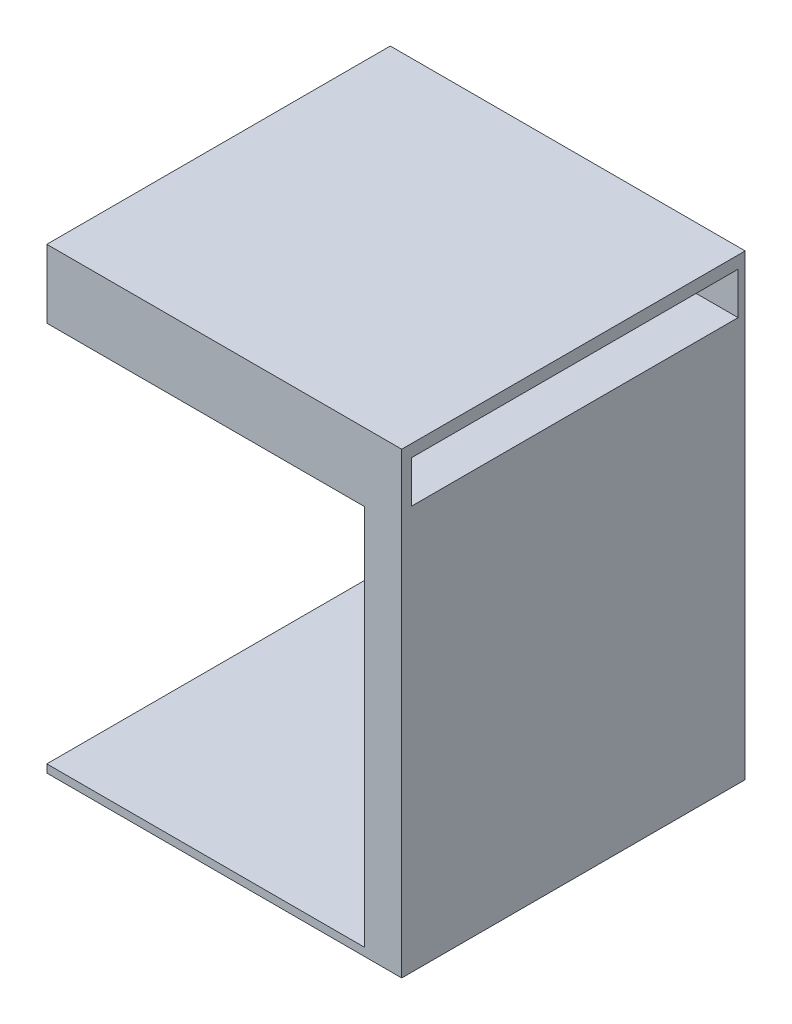
ISO-10303-21;
HEADER;
FILE_DESCRIPTION(('STEP AP214'),'2;1');
FILE_NAME('part.step','',(''),(''),'','','');
FILE_SCHEMA(('AUTOMOTIVE_DESIGN { 1 0 10303 214 1 1 1 1 }'));
ENDSEC;
DATA;
#1=APPLICATION_CONTEXT('core data for automotive mechanical design processes');
#2=APPLICATION_PROTOCOL_DEFINITION('international standard','automotive_design',2000,#1);
#3=PRODUCT_CONTEXT('',#1,'mechanical');
#4=PRODUCT('Part','Part','',(#3));
#5=PRODUCT_RELATED_PRODUCT_CATEGORY('part','',(#4));
#6=PRODUCT_DEFINITION_FORMATION('','',#4);
#7=PRODUCT_DEFINITION_CONTEXT('part definition',#1,'design');
#8=PRODUCT_DEFINITION('design','',#6,#7);
#9=PRODUCT_DEFINITION_SHAPE('','',#8);
#10=(LENGTH_UNIT() NAMED_UNIT(*) SI_UNIT(.MILLI.,.METRE.));
#11=(NAMED_UNIT(*) PLANE_ANGLE_UNIT() SI_UNIT($,.RADIAN.));
#12=(NAMED_UNIT(*) SI_UNIT($,.STERADIAN.) SOLID_ANGLE_UNIT());
#13=UNCERTAINTY_MEASURE_WITH_UNIT(LENGTH_MEASURE(1.E-05),#10,'distance_accuracy_value','');
#14=(GEOMETRIC_REPRESENTATION_CONTEXT(3) GLOBAL_UNCERTAINTY_ASSIGNED_CONTEXT((#13)) GLOBAL_UNIT_ASSIGNED_CONTEXT((#10,
#11,#12)) REPRESENTATION_CONTEXT('',''));
#15=CARTESIAN_POINT('',(0.,0.,0.));
#16=DIRECTION('',(0.,0.,1.));
#17=DIRECTION('',(1.,0.,0.));
#18=AXIS2_PLACEMENT_3D('',#15,#16,#17);
#19=CARTESIAN_POINT('',(-46.5,102.095291963001,-41.));
#20=DIRECTION('',(0.,1.,0.));
#21=DIRECTION('',(0.,0.,1.));
#22=AXIS2_PLACEMENT_3D('',#19,#20,#21);
#23=PLANE('',#22);
#24=DIRECTION('',(-1.,0.,0.));
#25=VECTOR('',#24,1.);
#26=CARTESIAN_POINT('',(-46.5,102.095291963001,45.));
#27=LINE('',#26,#25);
#28=CARTESIAN_POINT('',(36.6884651724041,102.095291963001,45.));
#29=VERTEX_POINT('',#28);
#30=CARTESIAN_POINT('',(-46.5,102.095291963001,45.));
#31=VERTEX_POINT('',#30);
#32=EDGE_CURVE('E212',#29,#31,#27,.T.);
#33=ORIENTED_EDGE('',*,*,#32,.T.);
#34=DIRECTION('',(0.,0.,1.));
#35=VECTOR('',#34,1.);
#36=CARTESIAN_POINT('',(-46.5,102.095291963001,-41.));
#37=LINE('',#36,#35);
#38=CARTESIAN_POINT('',(-46.5,102.095291963001,-41.));
#39=VERTEX_POINT('',#38);
#40=EDGE_CURVE('E228',#39,#31,#37,.T.);
#41=ORIENTED_EDGE('',*,*,#40,.F.);
#42=DIRECTION('',(-1.,0.,0.));
#43=VECTOR('',#42,1.);
#44=CARTESIAN_POINT('',(-46.5,102.095291963001,-41.));
#45=LINE('',#44,#43);
#46=CARTESIAN_POINT('',(36.6884651724041,102.095291963001,-41.));
#47=VERTEX_POINT('',#46);
#48=EDGE_CURVE('E219',#47,#39,#45,.T.);
#49=ORIENTED_EDGE('',*,*,#48,.F.);
#50=DIRECTION('',(0.,0.,1.));
#51=VECTOR('',#50,1.);
#52=CARTESIAN_POINT('',(36.6884651724041,102.095291963001,-41.));
#53=LINE('',#52,#51);
#54=EDGE_CURVE('E233',#47,#29,#53,.T.);
#55=ORIENTED_EDGE('',*,*,#54,.T.);
#56=EDGE_LOOP('',(#33,#41,#49,#55));
#57=FACE_BOUND('',#56,.T.);
#58=DIRECTION('',(0.,0.,1.));
#59=VECTOR('',#58,1.);
#60=CARTESIAN_POINT('',(13.5,102.095291963001,-35.659899798973));
#61=LINE('',#60,#59);
#62=CARTESIAN_POINT('',(13.5,102.095291963001,-35.659899798973));
#63=VERTEX_POINT('',#62);
#64=CARTESIAN_POINT('',(13.5,102.095291963001,38.7416195346867));
#65=VERTEX_POINT('',#64);
#66=EDGE_CURVE('E154',#63,#65,#61,.T.);
#67=ORIENTED_EDGE('',*,*,#66,.F.);
#68=DIRECTION('',(-1.,0.,0.));
#69=VECTOR('',#68,1.);
#70=CARTESIAN_POINT('',(13.5,102.095291963001,-35.659899798973));
#71=LINE('',#70,#69);
#72=CARTESIAN_POINT('',(-36.5,102.095291963001,-35.659899798973));
#73=VERTEX_POINT('',#72);
#74=EDGE_CURVE('E165',#63,#73,#71,.T.);
#75=ORIENTED_EDGE('',*,*,#74,.T.);
#76=DIRECTION('',(0.,0.,1.));
#77=VECTOR('',#76,1.);
#78=CARTESIAN_POINT('',(-36.5,102.095291963001,-35.659899798973));
#79=LINE('',#78,#77);
#80=CARTESIAN_POINT('',(-36.5,102.095291963001,38.7416195346867));
#81=VERTEX_POINT('',#80);
#82=EDGE_CURVE('E175',#73,#81,#79,.T.);
#83=ORIENTED_EDGE('',*,*,#82,.T.);
#84=DIRECTION('',(-1.,0.,0.));
#85=VECTOR('',#84,1.);
#86=CARTESIAN_POINT('',(13.5,102.095291963001,38.7416195346867));
#87=LINE('',#86,#85);
#88=EDGE_CURVE('E167',#65,#81,#87,.T.);
#89=ORIENTED_EDGE('',*,*,#88,.F.);
#90=EDGE_LOOP('',(#67,#75,#83,#89));
#91=FACE_BOUND('',#90,.T.);
#92=ADVANCED_FACE('F39',(#57,#91),#23,.F.);
#93=CARTESIAN_POINT('',(-39.5,105.785550359176,42.4103335057745));
#94=DIRECTION('',(0.,-1.,0.));
#95=DIRECTION('',(0.,0.,-1.));
#96=AXIS2_PLACEMENT_3D('',#93,#94,#95);
#97=PLANE('',#96);
#98=DIRECTION('',(0.,0.,-1.));
#99=VECTOR('',#98,1.);
#100=CARTESIAN_POINT('',(46.5,105.785550359176,42.4103335057745));
#101=LINE('',#100,#99);
#102=CARTESIAN_POINT('',(46.5,105.785550359176,42.4103335057745));
#103=VERTEX_POINT('',#102);
#104=CARTESIAN_POINT('',(46.5,105.785550359176,-43.144076299992));
#105=VERTEX_POINT('',#104);
#106=EDGE_CURVE('E193',#103,#105,#101,.T.);
#107=ORIENTED_EDGE('',*,*,#106,.T.);
#108=DIRECTION('',(1.,0.,0.));
#109=VECTOR('',#108,1.);
#110=CARTESIAN_POINT('',(-39.5,105.785550359176,-43.144076299992));
#111=LINE('',#110,#109);
#112=CARTESIAN_POINT('',(-39.5,105.785550359176,-43.144076299992));
#113=VERTEX_POINT('',#112);
#114=EDGE_CURVE('E206',#113,#105,#111,.T.);
#115=ORIENTED_EDGE('',*,*,#114,.F.);
#116=DIRECTION('',(0.,0.,-1.));
#117=VECTOR('',#116,1.);
#118=CARTESIAN_POINT('',(-39.5,105.785550359176,42.4103335057745));
#119=LINE('',#118,#117);
#120=CARTESIAN_POINT('',(-39.5,105.785550359176,42.4103335057745));
#121=VERTEX_POINT('',#120);
#122=EDGE_CURVE('E182',#121,#113,#119,.T.);
#123=ORIENTED_EDGE('',*,*,#122,.F.);
#124=DIRECTION('',(1.,0.,0.));
#125=VECTOR('',#124,1.);
#126=CARTESIAN_POINT('',(-39.5,105.785550359176,42.4103335057745));
#127=LINE('',#126,#125);
#128=EDGE_CURVE('E192',#121,#103,#127,.T.);
#129=ORIENTED_EDGE('',*,*,#128,.T.);
#130=EDGE_LOOP('',(#107,#115,#123,#129));
#131=FACE_BOUND('',#130,.T.);
#132=DIRECTION('',(0.,0.,-1.));
#133=VECTOR('',#132,1.);
#134=CARTESIAN_POINT('',(13.5,105.785550359176,42.4103335057745));
#135=LINE('',#134,#133);
#136=CARTESIAN_POINT('',(13.5,105.785550359176,38.7416195346867));
#137=VERTEX_POINT('',#136);
#138=CARTESIAN_POINT('',(13.5,105.785550359176,-35.659899798973));
#139=VERTEX_POINT('',#138);
#140=EDGE_CURVE('E11',#137,#139,#135,.T.);
#141=ORIENTED_EDGE('',*,*,#140,.F.);
#142=DIRECTION('',(-1.,0.,0.));
#143=VECTOR('',#142,1.);
#144=CARTESIAN_POINT('',(-39.5,105.785550359176,38.7416195346867));
#145=LINE('',#144,#143);
#146=CARTESIAN_POINT('',(-36.5,105.785550359176,38.7416195346867));
#147=VERTEX_POINT('',#146);
#148=EDGE_CURVE('E272',#137,#147,#145,.T.);
#149=ORIENTED_EDGE('',*,*,#148,.T.);
#150=DIRECTION('',(0.,0.,-1.));
#151=VECTOR('',#150,1.);
#152=CARTESIAN_POINT('',(-36.5,105.785550359176,42.4103335057745));
#153=LINE('',#152,#151);
#154=CARTESIAN_POINT('',(-36.5,105.785550359176,-35.659899798973));
#155=VERTEX_POINT('',#154);
#156=EDGE_CURVE('E269',#147,#155,#153,.T.);
#157=ORIENTED_EDGE('',*,*,#156,.T.);
#158=DIRECTION('',(1.,0.,0.));
#159=VECTOR('',#158,1.);
#160=CARTESIAN_POINT('',(-39.5,105.785550359176,-35.659899798973));
#161=LINE('',#160,#159);
#162=EDGE_CURVE('E50',#155,#139,#161,.T.);
#163=ORIENTED_EDGE('',*,*,#162,.T.);
#164=EDGE_LOOP('',(#141,#149,#157,#163));
#165=FACE_BOUND('',#164,.T.);
#166=ADVANCED_FACE('F277',(#131,#165),#97,.F.);
#167=CARTESIAN_POINT('',(-46.5,120.,45.));
#168=DIRECTION('',(0.,0.,-1.));
#169=DIRECTION('',(-1.,0.,0.));
#170=AXIS2_PLACEMENT_3D('',#167,#168,#169);
#171=PLANE('',#170);
#172=DIRECTION('',(1.,0.,0.));
#173=VECTOR('',#172,1.);
#174=CARTESIAN_POINT('',(-46.5,2.0952919630007,45.));
#175=LINE('',#174,#173);
#176=CARTESIAN_POINT('',(-46.5,2.0952919630007,45.));
#177=VERTEX_POINT('',#176);
#178=CARTESIAN_POINT('',(36.6884651724042,2.09529196300071,45.));
#179=VERTEX_POINT('',#178);
#180=EDGE_CURVE('E201',#177,#179,#175,.T.);
#181=ORIENTED_EDGE('',*,*,#180,.F.);
#182=DIRECTION('',(0.,-1.,0.));
#183=VECTOR('',#182,1.);
#184=CARTESIAN_POINT('',(-46.5,120.,45.));
#185=LINE('',#184,#183);
#186=CARTESIAN_POINT('',(-46.5,0.,45.));
#187=VERTEX_POINT('',#186);
#188=EDGE_CURVE('E257',#177,#187,#185,.T.);
#189=ORIENTED_EDGE('',*,*,#188,.T.);
#190=DIRECTION('',(1.,0.,0.));
#191=VECTOR('',#190,1.);
#192=CARTESIAN_POINT('',(-46.5,0.,45.));
#193=LINE('',#192,#191);
#194=CARTESIAN_POINT('',(46.5,0.,45.));
#195=VERTEX_POINT('',#194);
#196=EDGE_CURVE('E245',#187,#195,#193,.T.);
#197=ORIENTED_EDGE('',*,*,#196,.T.);
#198=DIRECTION('',(0.,-1.,0.));
#199=VECTOR('',#198,1.);
#200=CARTESIAN_POINT('',(46.5,120.,45.));
#201=LINE('',#200,#199);
#202=CARTESIAN_POINT('',(46.5,120.,45.));
#203=VERTEX_POINT('',#202);
#204=EDGE_CURVE('E249',#203,#195,#201,.T.);
#205=ORIENTED_EDGE('',*,*,#204,.F.);
#206=DIRECTION('',(1.,0.,0.));
#207=VECTOR('',#206,1.);
#208=CARTESIAN_POINT('',(-46.5,120.,45.));
#209=LINE('',#208,#207);
#210=CARTESIAN_POINT('',(-46.5,120.,45.));
#211=VERTEX_POINT('',#210);
#212=EDGE_CURVE('E250',#211,#203,#209,.T.);
#213=ORIENTED_EDGE('',*,*,#212,.F.);
#214=EDGE_CURVE('E261',#211,#31,#185,.T.);
#215=ORIENTED_EDGE('',*,*,#214,.T.);
#216=ORIENTED_EDGE('',*,*,#32,.F.);
#217=DIRECTION('',(0.,1.,0.));
#218=VECTOR('',#217,1.);
#219=CARTESIAN_POINT('',(36.6884651724041,102.095291963001,45.));
#220=LINE('',#219,#218);
#221=EDGE_CURVE('E223',#179,#29,#220,.T.);
#222=ORIENTED_EDGE('',*,*,#221,.F.);
#223=EDGE_LOOP('',(#181,#189,#197,#205,#213,#215,#216,#222));
#224=FACE_BOUND('',#223,.T.);
#225=ADVANCED_FACE('F296',(#224),#171,.F.);
#226=CARTESIAN_POINT('',(46.5,120.,-45.));
#227=DIRECTION('',(-1.,0.,0.));
#228=DIRECTION('',(0.,0.,1.));
#229=AXIS2_PLACEMENT_3D('',#226,#227,#228);
#230=PLANE('',#229);
#231=ORIENTED_EDGE('',*,*,#106,.F.);
#232=DIRECTION('',(0.,-1.,0.));
#233=VECTOR('',#232,1.);
#234=CARTESIAN_POINT('',(46.5,116.785550359176,42.4103335057745));
#235=LINE('',#234,#233);
#236=CARTESIAN_POINT('',(46.5,116.785550359176,42.4103335057745));
#237=VERTEX_POINT('',#236);
#238=EDGE_CURVE('E177',#237,#103,#235,.T.);
#239=ORIENTED_EDGE('',*,*,#238,.F.);
#240=DIRECTION('',(0.,0.,1.));
#241=VECTOR('',#240,1.);
#242=CARTESIAN_POINT('',(46.5,116.785550359176,42.4103335057745));
#243=LINE('',#242,#241);
#244=CARTESIAN_POINT('',(46.5,116.785550359176,-43.144076299992));
#245=VERTEX_POINT('',#244);
#246=EDGE_CURVE('E185',#245,#237,#243,.T.);
#247=ORIENTED_EDGE('',*,*,#246,.F.);
#248=DIRECTION('',(0.,1.,0.));
#249=VECTOR('',#248,1.);
#250=CARTESIAN_POINT('',(46.5,116.785550359176,-43.144076299992));
#251=LINE('',#250,#249);
#252=EDGE_CURVE('E198',#105,#245,#251,.T.);
#253=ORIENTED_EDGE('',*,*,#252,.F.);
#254=EDGE_LOOP('',(#231,#239,#247,#253));
#255=FACE_BOUND('',#254,.T.);
#256=DIRECTION('',(0.,0.,-1.));
#257=VECTOR('',#256,1.);
#258=CARTESIAN_POINT('',(46.5,0.,-45.));
#259=LINE('',#258,#257);
#260=CARTESIAN_POINT('',(46.5,0.,-45.));
#261=VERTEX_POINT('',#260);
#262=EDGE_CURVE('E235',#195,#261,#259,.T.);
#263=ORIENTED_EDGE('',*,*,#262,.T.);
#264=DIRECTION('',(0.,-1.,0.));
#265=VECTOR('',#264,1.);
#266=CARTESIAN_POINT('',(46.5,120.,-45.));
#267=LINE('',#266,#265);
#268=CARTESIAN_POINT('',(46.5,120.,-45.));
#269=VERTEX_POINT('',#268);
#270=EDGE_CURVE('E270',#269,#261,#267,.T.);
#271=ORIENTED_EDGE('',*,*,#270,.F.);
#272=DIRECTION('',(0.,0.,-1.));
#273=VECTOR('',#272,1.);
#274=CARTESIAN_POINT('',(46.5,120.,-45.));
#275=LINE('',#274,#273);
#276=EDGE_CURVE('E239',#203,#269,#275,.T.);
#277=ORIENTED_EDGE('',*,*,#276,.F.);
#278=ORIENTED_EDGE('',*,*,#204,.T.);
#279=EDGE_LOOP('',(#263,#271,#277,#278));
#280=FACE_BOUND('',#279,.T.);
#281=ADVANCED_FACE('F41',(#255,#280),#230,.F.);
#282=CARTESIAN_POINT('',(-46.5,120.,-45.));
#283=DIRECTION('',(0.,0.,1.));
#284=DIRECTION('',(1.,0.,0.));
#285=AXIS2_PLACEMENT_3D('',#282,#283,#284);
#286=PLANE('',#285);
#287=DIRECTION('',(-1.,0.,0.));
#288=VECTOR('',#287,1.);
#289=CARTESIAN_POINT('',(-46.5,0.,-45.));
#290=LINE('',#289,#288);
#291=CARTESIAN_POINT('',(-46.5,0.,-45.));
#292=VERTEX_POINT('',#291);
#293=EDGE_CURVE('E252',#261,#292,#290,.T.);
#294=ORIENTED_EDGE('',*,*,#293,.T.);
#295=DIRECTION('',(0.,-1.,0.));
#296=VECTOR('',#295,1.);
#297=CARTESIAN_POINT('',(-46.5,120.,-45.));
#298=LINE('',#297,#296);
#299=CARTESIAN_POINT('',(-46.5,120.,-45.));
#300=VERTEX_POINT('',#299);
#301=EDGE_CURVE('E262',#300,#292,#298,.T.);
#302=ORIENTED_EDGE('',*,*,#301,.F.);
#303=DIRECTION('',(-1.,0.,0.));
#304=VECTOR('',#303,1.);
#305=CARTESIAN_POINT('',(-46.5,120.,-45.));
#306=LINE('',#305,#304);
#307=EDGE_CURVE('E241',#269,#300,#306,.T.);
#308=ORIENTED_EDGE('',*,*,#307,.F.);
#309=ORIENTED_EDGE('',*,*,#270,.T.);
#310=EDGE_LOOP('',(#294,#302,#308,#309));
#311=FACE_BOUND('',#310,.T.);
#312=ADVANCED_FACE('F324',(#311),#286,.F.);
#313=CARTESIAN_POINT('',(-46.5,120.,-45.));
#314=DIRECTION('',(1.,0.,0.));
#315=DIRECTION('',(0.,0.,-1.));
#316=AXIS2_PLACEMENT_3D('',#313,#314,#315);
#317=PLANE('',#316);
#318=DIRECTION('',(0.,-1.,0.));
#319=VECTOR('',#318,1.);
#320=CARTESIAN_POINT('',(-46.5,102.095291963001,-41.));
#321=LINE('',#320,#319);
#322=CARTESIAN_POINT('',(-46.5,2.0952919630007,-41.));
#323=VERTEX_POINT('',#322);
#324=EDGE_CURVE('E209',#39,#323,#321,.T.);
#325=ORIENTED_EDGE('',*,*,#324,.F.);
#326=ORIENTED_EDGE('',*,*,#40,.T.);
#327=ORIENTED_EDGE('',*,*,#214,.F.);
#328=DIRECTION('',(0.,0.,1.));
#329=VECTOR('',#328,1.);
#330=CARTESIAN_POINT('',(-46.5,120.,-45.));
#331=LINE('',#330,#329);
#332=EDGE_CURVE('E242',#300,#211,#331,.T.);
#333=ORIENTED_EDGE('',*,*,#332,.F.);
#334=ORIENTED_EDGE('',*,*,#301,.T.);
#335=DIRECTION('',(0.,0.,1.));
#336=VECTOR('',#335,1.);
#337=CARTESIAN_POINT('',(-46.5,0.,-45.));
#338=LINE('',#337,#336);
#339=EDGE_CURVE('E255',#292,#187,#338,.T.);
#340=ORIENTED_EDGE('',*,*,#339,.T.);
#341=ORIENTED_EDGE('',*,*,#188,.F.);
#342=DIRECTION('',(0.,0.,1.));
#343=VECTOR('',#342,1.);
#344=CARTESIAN_POINT('',(-46.5,2.0952919630007,-41.));
#345=LINE('',#344,#343);
#346=EDGE_CURVE('E224',#323,#177,#345,.T.);
#347=ORIENTED_EDGE('',*,*,#346,.F.);
#348=EDGE_LOOP('',(#325,#326,#327,#333,#334,#340,#341,#347));
#349=FACE_BOUND('',#348,.T.);
#350=ADVANCED_FACE('F316',(#349),#317,.F.);
#351=CARTESIAN_POINT('',(0.,120.,0.));
#352=DIRECTION('',(0.,1.,0.));
#353=DIRECTION('',(0.,0.,1.));
#354=AXIS2_PLACEMENT_3D('',#351,#352,#353);
#355=PLANE('',#354);
#356=ORIENTED_EDGE('',*,*,#276,.T.);
#357=ORIENTED_EDGE('',*,*,#307,.T.);
#358=ORIENTED_EDGE('',*,*,#332,.T.);
#359=ORIENTED_EDGE('',*,*,#212,.T.);
#360=EDGE_LOOP('',(#356,#357,#358,#359));
#361=FACE_BOUND('',#360,.T.);
#362=ADVANCED_FACE('F311',(#361),#355,.T.);
#363=CARTESIAN_POINT('',(0.,0.,0.));
#364=DIRECTION('',(0.,1.,0.));
#365=DIRECTION('',(0.,0.,1.));
#366=AXIS2_PLACEMENT_3D('',#363,#364,#365);
#367=PLANE('',#366);
#368=ORIENTED_EDGE('',*,*,#262,.F.);
#369=ORIENTED_EDGE('',*,*,#196,.F.);
#370=ORIENTED_EDGE('',*,*,#339,.F.);
#371=ORIENTED_EDGE('',*,*,#293,.F.);
#372=EDGE_LOOP('',(#368,#369,#370,#371));
#373=FACE_BOUND('',#372,.T.);
#374=ADVANCED_FACE('F306',(#373),#367,.F.);
#375=CARTESIAN_POINT('',(36.6884651724041,102.095291963001,-41.));
#376=DIRECTION('',(1.,0.,0.));
#377=DIRECTION('',(0.,1.,0.));
#378=AXIS2_PLACEMENT_3D('',#375,#376,#377);
#379=PLANE('',#378);
#380=ORIENTED_EDGE('',*,*,#221,.T.);
#381=ORIENTED_EDGE('',*,*,#54,.F.);
#382=DIRECTION('',(0.,1.,0.));
#383=VECTOR('',#382,1.);
#384=CARTESIAN_POINT('',(36.6884651724041,102.095291963001,-41.));
#385=LINE('',#384,#383);
#386=CARTESIAN_POINT('',(36.6884651724042,2.0952919630007,-41.));
#387=VERTEX_POINT('',#386);
#388=EDGE_CURVE('E220',#387,#47,#385,.T.);
#389=ORIENTED_EDGE('',*,*,#388,.F.);
#390=DIRECTION('',(0.,0.,1.));
#391=VECTOR('',#390,1.);
#392=CARTESIAN_POINT('',(36.6884651724042,2.0952919630007,-41.));
#393=LINE('',#392,#391);
#394=EDGE_CURVE('E231',#387,#179,#393,.T.);
#395=ORIENTED_EDGE('',*,*,#394,.T.);
#396=EDGE_LOOP('',(#380,#381,#389,#395));
#397=FACE_BOUND('',#396,.T.);
#398=ADVANCED_FACE('F304',(#397),#379,.F.);
#399=CARTESIAN_POINT('',(-46.5,2.0952919630007,-41.));
#400=DIRECTION('',(0.,-1.,0.));
#401=DIRECTION('',(0.,0.,-1.));
#402=AXIS2_PLACEMENT_3D('',#399,#400,#401);
#403=PLANE('',#402);
#404=ORIENTED_EDGE('',*,*,#180,.T.);
#405=ORIENTED_EDGE('',*,*,#394,.F.);
#406=DIRECTION('',(1.,0.,0.));
#407=VECTOR('',#406,1.);
#408=CARTESIAN_POINT('',(-46.5,2.0952919630007,-41.));
#409=LINE('',#408,#407);
#410=EDGE_CURVE('E213',#323,#387,#409,.T.);
#411=ORIENTED_EDGE('',*,*,#410,.F.);
#412=ORIENTED_EDGE('',*,*,#346,.T.);
#413=EDGE_LOOP('',(#404,#405,#411,#412));
#414=FACE_BOUND('',#413,.T.);
#415=ADVANCED_FACE('F307',(#414),#403,.F.);
#416=CARTESIAN_POINT('',(0.,0.,-41.));
#417=DIRECTION('',(0.,0.,1.));
#418=DIRECTION('',(1.,0.,0.));
#419=AXIS2_PLACEMENT_3D('',#416,#417,#418);
#420=PLANE('',#419);
#421=ORIENTED_EDGE('',*,*,#324,.T.);
#422=ORIENTED_EDGE('',*,*,#410,.T.);
#423=ORIENTED_EDGE('',*,*,#388,.T.);
#424=ORIENTED_EDGE('',*,*,#48,.T.);
#425=EDGE_LOOP('',(#421,#422,#423,#424));
#426=FACE_BOUND('',#425,.T.);
#427=ADVANCED_FACE('F305',(#426),#420,.T.);
#428=CARTESIAN_POINT('',(-39.5,116.785550359176,42.4103335057745));
#429=DIRECTION('',(0.,0.,1.));
#430=DIRECTION('',(1.,0.,0.));
#431=AXIS2_PLACEMENT_3D('',#428,#429,#430);
#432=PLANE('',#431);
#433=ORIENTED_EDGE('',*,*,#238,.T.);
#434=ORIENTED_EDGE('',*,*,#128,.F.);
#435=DIRECTION('',(0.,-1.,0.));
#436=VECTOR('',#435,1.);
#437=CARTESIAN_POINT('',(-39.5,116.785550359176,42.4103335057745));
#438=LINE('',#437,#436);
#439=CARTESIAN_POINT('',(-39.5,116.785550359176,42.4103335057745));
#440=VERTEX_POINT('',#439);
#441=EDGE_CURVE('E178',#440,#121,#438,.T.);
#442=ORIENTED_EDGE('',*,*,#441,.F.);
#443=DIRECTION('',(1.,0.,0.));
#444=VECTOR('',#443,1.);
#445=CARTESIAN_POINT('',(-39.5,116.785550359176,42.4103335057745));
#446=LINE('',#445,#444);
#447=EDGE_CURVE('E203',#440,#237,#446,.T.);
#448=ORIENTED_EDGE('',*,*,#447,.T.);
#449=EDGE_LOOP('',(#433,#434,#442,#448));
#450=FACE_BOUND('',#449,.T.);
#451=ADVANCED_FACE('F353',(#450),#432,.F.);
#452=CARTESIAN_POINT('',(-39.5,116.785550359176,42.4103335057745));
#453=DIRECTION('',(0.,1.,0.));
#454=DIRECTION('',(0.,0.,1.));
#455=AXIS2_PLACEMENT_3D('',#452,#453,#454);
#456=PLANE('',#455);
#457=ORIENTED_EDGE('',*,*,#246,.T.);
#458=ORIENTED_EDGE('',*,*,#447,.F.);
#459=DIRECTION('',(0.,0.,1.));
#460=VECTOR('',#459,1.);
#461=CARTESIAN_POINT('',(-39.5,116.785550359176,42.4103335057745));
#462=LINE('',#461,#460);
#463=CARTESIAN_POINT('',(-39.5,116.785550359176,-43.144076299992));
#464=VERTEX_POINT('',#463);
#465=EDGE_CURVE('E190',#464,#440,#462,.T.);
#466=ORIENTED_EDGE('',*,*,#465,.F.);
#467=DIRECTION('',(1.,0.,0.));
#468=VECTOR('',#467,1.);
#469=CARTESIAN_POINT('',(-39.5,116.785550359176,-43.144076299992));
#470=LINE('',#469,#468);
#471=EDGE_CURVE('E204',#464,#245,#470,.T.);
#472=ORIENTED_EDGE('',*,*,#471,.T.);
#473=EDGE_LOOP('',(#457,#458,#466,#472));
#474=FACE_BOUND('',#473,.T.);
#475=ADVANCED_FACE('F358',(#474),#456,.F.);
#476=CARTESIAN_POINT('',(-39.5,116.785550359176,-43.144076299992));
#477=DIRECTION('',(0.,0.,-1.));
#478=DIRECTION('',(-1.,0.,0.));
#479=AXIS2_PLACEMENT_3D('',#476,#477,#478);
#480=PLANE('',#479);
#481=ORIENTED_EDGE('',*,*,#252,.T.);
#482=ORIENTED_EDGE('',*,*,#471,.F.);
#483=DIRECTION('',(0.,1.,0.));
#484=VECTOR('',#483,1.);
#485=CARTESIAN_POINT('',(-39.5,116.785550359176,-43.144076299992));
#486=LINE('',#485,#484);
#487=EDGE_CURVE('E183',#113,#464,#486,.T.);
#488=ORIENTED_EDGE('',*,*,#487,.F.);
#489=ORIENTED_EDGE('',*,*,#114,.T.);
#490=EDGE_LOOP('',(#481,#482,#488,#489));
#491=FACE_BOUND('',#490,.T.);
#492=ADVANCED_FACE('F361',(#491),#480,.F.);
#493=CARTESIAN_POINT('',(-39.5,0.,0.));
#494=DIRECTION('',(1.,0.,0.));
#495=DIRECTION('',(0.,0.,-1.));
#496=AXIS2_PLACEMENT_3D('',#493,#494,#495);
#497=PLANE('',#496);
#498=ORIENTED_EDGE('',*,*,#441,.T.);
#499=ORIENTED_EDGE('',*,*,#122,.T.);
#500=ORIENTED_EDGE('',*,*,#487,.T.);
#501=ORIENTED_EDGE('',*,*,#465,.T.);
#502=EDGE_LOOP('',(#498,#499,#500,#501));
#503=FACE_BOUND('',#502,.T.);
#504=ADVANCED_FACE('F290',(#503),#497,.T.);
#505=CARTESIAN_POINT('',(13.5,108.573772977202,-35.659899798973));
#506=DIRECTION('',(0.,0.,-1.));
#507=DIRECTION('',(-1.,0.,0.));
#508=AXIS2_PLACEMENT_3D('',#505,#506,#507);
#509=PLANE('',#508);
#510=DIRECTION('',(0.,-1.,0.));
#511=VECTOR('',#510,1.);
#512=CARTESIAN_POINT('',(-36.5,108.573772977202,-35.659899798973));
#513=LINE('',#512,#511);
#514=EDGE_CURVE('E56',#155,#73,#513,.T.);
#515=ORIENTED_EDGE('',*,*,#514,.T.);
#516=ORIENTED_EDGE('',*,*,#74,.F.);
#517=DIRECTION('',(0.,-1.,0.));
#518=VECTOR('',#517,1.);
#519=CARTESIAN_POINT('',(13.5,108.573772977202,-35.659899798973));
#520=LINE('',#519,#518);
#521=EDGE_CURVE('E147',#139,#63,#520,.T.);
#522=ORIENTED_EDGE('',*,*,#521,.F.);
#523=ORIENTED_EDGE('',*,*,#162,.F.);
#524=EDGE_LOOP('',(#515,#516,#522,#523));
#525=FACE_BOUND('',#524,.T.);
#526=ADVANCED_FACE('F162',(#525),#509,.F.);
#527=CARTESIAN_POINT('',(13.5,108.573772977202,38.7416195346867));
#528=DIRECTION('',(0.,0.,1.));
#529=DIRECTION('',(1.,0.,0.));
#530=AXIS2_PLACEMENT_3D('',#527,#528,#529);
#531=PLANE('',#530);
#532=DIRECTION('',(0.,1.,0.));
#533=VECTOR('',#532,1.);
#534=CARTESIAN_POINT('',(13.5,108.573772977202,38.7416195346867));
#535=LINE('',#534,#533);
#536=EDGE_CURVE('E170',#65,#137,#535,.T.);
#537=ORIENTED_EDGE('',*,*,#536,.F.);
#538=ORIENTED_EDGE('',*,*,#88,.T.);
#539=DIRECTION('',(0.,1.,0.));
#540=VECTOR('',#539,1.);
#541=CARTESIAN_POINT('',(-36.5,108.573772977202,38.7416195346867));
#542=LINE('',#541,#540);
#543=EDGE_CURVE('E53',#81,#147,#542,.T.);
#544=ORIENTED_EDGE('',*,*,#543,.T.);
#545=ORIENTED_EDGE('',*,*,#148,.F.);
#546=EDGE_LOOP('',(#537,#538,#544,#545));
#547=FACE_BOUND('',#546,.T.);
#548=ADVANCED_FACE('F276',(#547),#531,.F.);
#549=CARTESIAN_POINT('',(13.5,0.,0.));
#550=DIRECTION('',(-1.,0.,0.));
#551=DIRECTION('',(0.,0.,1.));
#552=AXIS2_PLACEMENT_3D('',#549,#550,#551);
#553=PLANE('',#552);
#554=ORIENTED_EDGE('',*,*,#140,.T.);
#555=ORIENTED_EDGE('',*,*,#521,.T.);
#556=ORIENTED_EDGE('',*,*,#66,.T.);
#557=ORIENTED_EDGE('',*,*,#536,.T.);
#558=EDGE_LOOP('',(#554,#555,#556,#557));
#559=FACE_BOUND('',#558,.T.);
#560=ADVANCED_FACE('F155',(#559),#553,.T.);
#561=CARTESIAN_POINT('',(-36.5,0.,0.));
#562=DIRECTION('',(-1.,0.,0.));
#563=DIRECTION('',(0.,0.,1.));
#564=AXIS2_PLACEMENT_3D('',#561,#562,#563);
#565=PLANE('',#564);
#566=ORIENTED_EDGE('',*,*,#543,.F.);
#567=ORIENTED_EDGE('',*,*,#82,.F.);
#568=ORIENTED_EDGE('',*,*,#514,.F.);
#569=ORIENTED_EDGE('',*,*,#156,.F.);
#570=EDGE_LOOP('',(#566,#567,#568,#569));
#571=FACE_BOUND('',#570,.T.);
#572=ADVANCED_FACE('F280',(#571),#565,.F.);
#573=CLOSED_SHELL('',(#92,#166,#225,#281,#312,#350,#362,#374,#398,#415,#427,#451,#475,#492,#504,
#526,#548,#560,#572));
#574=MANIFOLD_SOLID_BREP('B2',#573);
#575=ADVANCED_BREP_SHAPE_REPRESENTATION('',(#18,#574),#14);
#576=SHAPE_DEFINITION_REPRESENTATION(#9,#575);
ENDSEC;
END-ISO-10303-21;
